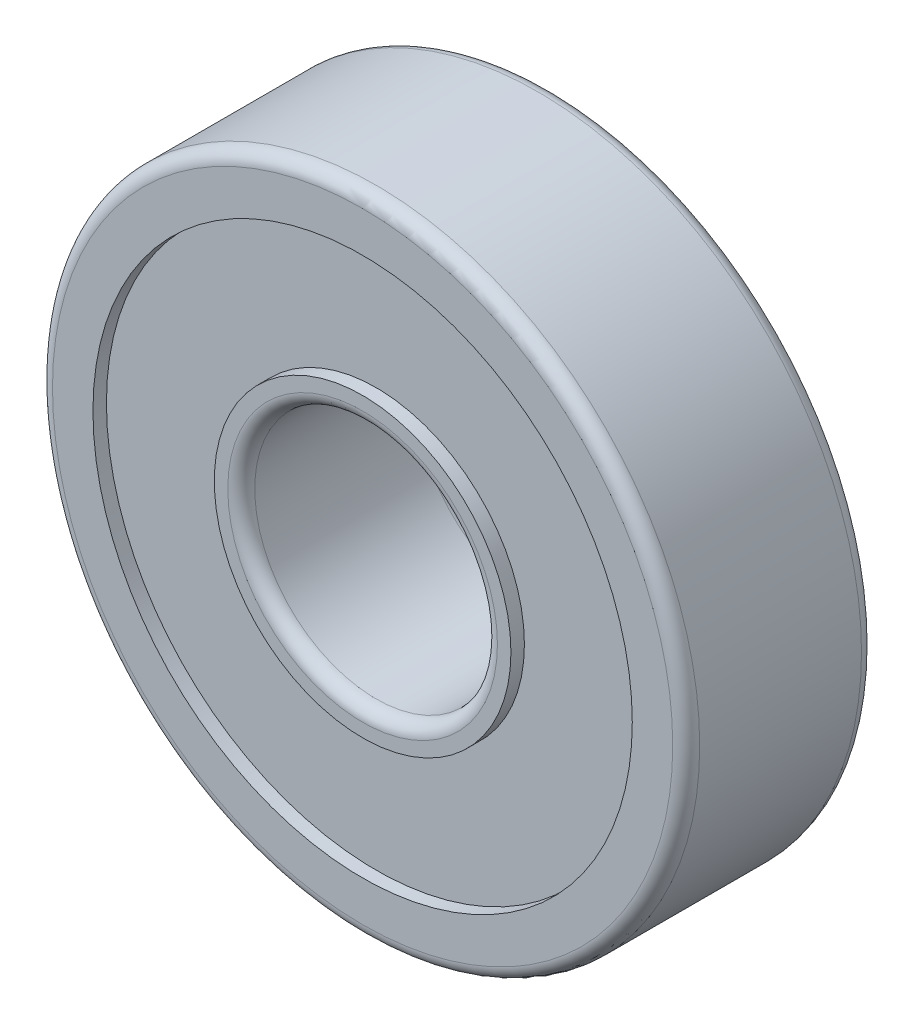
ISO-10303-21;
HEADER;
FILE_DESCRIPTION(('STEP AP214'),'2;1');
FILE_NAME('part.step','',(''),(''),'','','');
FILE_SCHEMA(('AUTOMOTIVE_DESIGN { 1 0 10303 214 1 1 1 1 }'));
ENDSEC;
DATA;
#1=APPLICATION_CONTEXT('core data for automotive mechanical design processes');
#2=APPLICATION_PROTOCOL_DEFINITION('international standard','automotive_design',2000,#1);
#3=PRODUCT_CONTEXT('',#1,'mechanical');
#4=PRODUCT('Part','Part','',(#3));
#5=PRODUCT_RELATED_PRODUCT_CATEGORY('part','',(#4));
#6=PRODUCT_DEFINITION_FORMATION('','',#4);
#7=PRODUCT_DEFINITION_CONTEXT('part definition',#1,'design');
#8=PRODUCT_DEFINITION('design','',#6,#7);
#9=PRODUCT_DEFINITION_SHAPE('','',#8);
#10=(LENGTH_UNIT() NAMED_UNIT(*) SI_UNIT(.MILLI.,.METRE.));
#11=(NAMED_UNIT(*) PLANE_ANGLE_UNIT() SI_UNIT($,.RADIAN.));
#12=(NAMED_UNIT(*) SI_UNIT($,.STERADIAN.) SOLID_ANGLE_UNIT());
#13=UNCERTAINTY_MEASURE_WITH_UNIT(LENGTH_MEASURE(1.E-05),#10,'distance_accuracy_value','');
#14=(GEOMETRIC_REPRESENTATION_CONTEXT(3) GLOBAL_UNCERTAINTY_ASSIGNED_CONTEXT((#13)) GLOBAL_UNIT_ASSIGNED_CONTEXT((#10,
#11,#12)) REPRESENTATION_CONTEXT('',''));
#15=CARTESIAN_POINT('',(0.,0.,0.));
#16=DIRECTION('',(0.,0.,1.));
#17=DIRECTION('',(1.,0.,0.));
#18=AXIS2_PLACEMENT_3D('',#15,#16,#17);
#19=CARTESIAN_POINT('',(0.,0.,-3.5));
#20=DIRECTION('',(0.,0.,1.));
#21=DIRECTION('',(1.,0.,0.));
#22=AXIS2_PLACEMENT_3D('',#19,#20,#21);
#23=PLANE('',#22);
#24=CARTESIAN_POINT('',(0.,0.,-3.5));
#25=DIRECTION('',(0.,0.,1.));
#26=DIRECTION('',(1.,0.,0.));
#27=AXIS2_PLACEMENT_3D('',#24,#25,#26);
#28=CIRCLE('',#27,5.);
#29=CARTESIAN_POINT('',(5.,0.,-3.5));
#30=VERTEX_POINT('',#29);
#31=EDGE_CURVE('E44',#30,#30,#28,.T.);
#32=ORIENTED_EDGE('',*,*,#31,.T.);
#33=EDGE_LOOP('',(#32));
#34=FACE_BOUND('',#33,.T.);
#35=CARTESIAN_POINT('',(0.,0.,-3.5));
#36=DIRECTION('',(0.,0.,1.));
#37=DIRECTION('',(1.,0.,0.));
#38=AXIS2_PLACEMENT_3D('',#35,#36,#37);
#39=CIRCLE('',#38,5.5);
#40=CARTESIAN_POINT('',(5.5,0.,-3.5));
#41=VERTEX_POINT('',#40);
#42=EDGE_CURVE('E84',#41,#41,#39,.T.);
#43=ORIENTED_EDGE('',*,*,#42,.F.);
#44=EDGE_LOOP('',(#43));
#45=FACE_BOUND('',#44,.T.);
#46=ADVANCED_FACE('F33',(#34,#45),#23,.F.);
#47=CARTESIAN_POINT('',(0.,0.,3.5));
#48=DIRECTION('',(0.,0.,1.));
#49=DIRECTION('',(1.,0.,0.));
#50=AXIS2_PLACEMENT_3D('',#47,#48,#49);
#51=PLANE('',#50);
#52=CARTESIAN_POINT('',(0.,0.,3.5));
#53=DIRECTION('',(0.,0.,1.));
#54=DIRECTION('',(1.,0.,0.));
#55=AXIS2_PLACEMENT_3D('',#52,#53,#54);
#56=CIRCLE('',#55,5.);
#57=CARTESIAN_POINT('',(5.,0.,3.5));
#58=VERTEX_POINT('',#57);
#59=EDGE_CURVE('E53',#58,#58,#56,.F.);
#60=ORIENTED_EDGE('',*,*,#59,.T.);
#61=EDGE_LOOP('',(#60));
#62=FACE_BOUND('',#61,.T.);
#63=CARTESIAN_POINT('',(0.,0.,3.5));
#64=DIRECTION('',(0.,0.,1.));
#65=DIRECTION('',(1.,0.,0.));
#66=AXIS2_PLACEMENT_3D('',#63,#64,#65);
#67=CIRCLE('',#66,5.5);
#68=CARTESIAN_POINT('',(5.5,0.,3.5));
#69=VERTEX_POINT('',#68);
#70=EDGE_CURVE('E72',#69,#69,#67,.T.);
#71=ORIENTED_EDGE('',*,*,#70,.T.);
#72=EDGE_LOOP('',(#71));
#73=FACE_BOUND('',#72,.T.);
#74=ADVANCED_FACE('F100',(#62,#73),#51,.T.);
#75=CARTESIAN_POINT('',(0.,0.,3.5));
#76=DIRECTION('',(0.,0.,1.));
#77=DIRECTION('',(1.,0.,0.));
#78=AXIS2_PLACEMENT_3D('',#75,#76,#77);
#79=CIRCLE('',#78,10.);
#80=CARTESIAN_POINT('',(10.,0.,3.5));
#81=VERTEX_POINT('',#80);
#82=EDGE_CURVE('E66',#81,#81,#79,.T.);
#83=ORIENTED_EDGE('',*,*,#82,.F.);
#84=EDGE_LOOP('',(#83));
#85=FACE_BOUND('',#84,.T.);
#86=CARTESIAN_POINT('',(0.,0.,3.5));
#87=DIRECTION('',(0.,0.,1.));
#88=DIRECTION('',(1.,0.,0.));
#89=AXIS2_PLACEMENT_3D('',#86,#87,#88);
#90=CIRCLE('',#89,11.5);
#91=CARTESIAN_POINT('',(11.5,0.,3.5));
#92=VERTEX_POINT('',#91);
#93=EDGE_CURVE('E56',#92,#92,#90,.T.);
#94=ORIENTED_EDGE('',*,*,#93,.T.);
#95=EDGE_LOOP('',(#94));
#96=FACE_BOUND('',#95,.T.);
#97=ADVANCED_FACE('F107',(#85,#96),#51,.T.);
#98=CARTESIAN_POINT('',(0.,0.,-3.5));
#99=DIRECTION('',(0.,0.,1.));
#100=DIRECTION('',(1.,0.,0.));
#101=AXIS2_PLACEMENT_3D('',#98,#99,#100);
#102=CIRCLE('',#101,10.);
#103=CARTESIAN_POINT('',(10.,0.,-3.5));
#104=VERTEX_POINT('',#103);
#105=EDGE_CURVE('E78',#104,#104,#102,.T.);
#106=ORIENTED_EDGE('',*,*,#105,.T.);
#107=EDGE_LOOP('',(#106));
#108=FACE_BOUND('',#107,.T.);
#109=CARTESIAN_POINT('',(0.,0.,-3.5));
#110=DIRECTION('',(0.,0.,1.));
#111=DIRECTION('',(1.,0.,0.));
#112=AXIS2_PLACEMENT_3D('',#109,#110,#111);
#113=CIRCLE('',#112,11.5);
#114=CARTESIAN_POINT('',(11.5,0.,-3.5));
#115=VERTEX_POINT('',#114);
#116=EDGE_CURVE('E48',#115,#115,#113,.F.);
#117=ORIENTED_EDGE('',*,*,#116,.T.);
#118=EDGE_LOOP('',(#117));
#119=FACE_BOUND('',#118,.T.);
#120=ADVANCED_FACE('F103',(#108,#119),#23,.F.);
#121=CARTESIAN_POINT('',(0.,0.,3.5));
#122=DIRECTION('',(0.,0.,-1.));
#123=DIRECTION('',(-1.,0.,0.));
#124=AXIS2_PLACEMENT_3D('',#121,#122,#123);
#125=CYLINDRICAL_SURFACE('',#124,12.);
#126=CARTESIAN_POINT('',(0.,0.,-3.));
#127=DIRECTION('',(0.,0.,1.));
#128=DIRECTION('',(1.,0.,0.));
#129=AXIS2_PLACEMENT_3D('',#126,#127,#128);
#130=CIRCLE('',#129,12.);
#131=CARTESIAN_POINT('',(12.,0.,-3.));
#132=VERTEX_POINT('',#131);
#133=EDGE_CURVE('E10',#132,#132,#130,.T.);
#134=ORIENTED_EDGE('',*,*,#133,.T.);
#135=EDGE_LOOP('',(#134));
#136=FACE_BOUND('',#135,.T.);
#137=CARTESIAN_POINT('',(0.,0.,3.));
#138=DIRECTION('',(0.,0.,1.));
#139=DIRECTION('',(1.,0.,0.));
#140=AXIS2_PLACEMENT_3D('',#137,#138,#139);
#141=CIRCLE('',#140,12.);
#142=CARTESIAN_POINT('',(12.,0.,3.));
#143=VERTEX_POINT('',#142);
#144=EDGE_CURVE('E40',#143,#143,#141,.F.);
#145=ORIENTED_EDGE('',*,*,#144,.T.);
#146=EDGE_LOOP('',(#145));
#147=FACE_BOUND('',#146,.T.);
#148=ADVANCED_FACE('F112',(#136,#147),#125,.T.);
#149=CARTESIAN_POINT('',(0.,0.,3.5));
#150=DIRECTION('',(0.,0.,-1.));
#151=DIRECTION('',(-1.,0.,0.));
#152=AXIS2_PLACEMENT_3D('',#149,#150,#151);
#153=CYLINDRICAL_SURFACE('',#152,4.5);
#154=CARTESIAN_POINT('',(0.,0.,3.));
#155=DIRECTION('',(0.,0.,1.));
#156=DIRECTION('',(1.,0.,0.));
#157=AXIS2_PLACEMENT_3D('',#154,#155,#156);
#158=CIRCLE('',#157,4.5);
#159=CARTESIAN_POINT('',(4.5,0.,3.));
#160=VERTEX_POINT('',#159);
#161=EDGE_CURVE('E59',#160,#160,#158,.T.);
#162=ORIENTED_EDGE('',*,*,#161,.T.);
#163=EDGE_LOOP('',(#162));
#164=FACE_BOUND('',#163,.T.);
#165=CARTESIAN_POINT('',(0.,0.,-3.));
#166=DIRECTION('',(0.,0.,1.));
#167=DIRECTION('',(1.,0.,0.));
#168=AXIS2_PLACEMENT_3D('',#165,#166,#167);
#169=CIRCLE('',#168,4.5);
#170=CARTESIAN_POINT('',(4.5,0.,-3.));
#171=VERTEX_POINT('',#170);
#172=EDGE_CURVE('E62',#171,#171,#169,.F.);
#173=ORIENTED_EDGE('',*,*,#172,.T.);
#174=EDGE_LOOP('',(#173));
#175=FACE_BOUND('',#174,.T.);
#176=ADVANCED_FACE('F118',(#164,#175),#153,.F.);
#177=CARTESIAN_POINT('',(0.,0.,3.));
#178=DIRECTION('',(0.,0.,1.));
#179=DIRECTION('',(1.,0.,0.));
#180=AXIS2_PLACEMENT_3D('',#177,#178,#179);
#181=TOROIDAL_SURFACE('',#180,5.,0.5);
#182=ORIENTED_EDGE('',*,*,#59,.F.);
#183=EDGE_LOOP('',(#182));
#184=FACE_BOUND('',#183,.T.);
#185=ORIENTED_EDGE('',*,*,#161,.F.);
#186=EDGE_LOOP('',(#185));
#187=FACE_BOUND('',#186,.T.);
#188=ADVANCED_FACE('F134',(#184,#187),#181,.T.);
#189=CARTESIAN_POINT('',(0.,0.,-3.));
#190=DIRECTION('',(0.,0.,1.));
#191=DIRECTION('',(1.,0.,0.));
#192=AXIS2_PLACEMENT_3D('',#189,#190,#191);
#193=TOROIDAL_SURFACE('',#192,5.,0.5);
#194=ORIENTED_EDGE('',*,*,#172,.F.);
#195=EDGE_LOOP('',(#194));
#196=FACE_BOUND('',#195,.T.);
#197=ORIENTED_EDGE('',*,*,#31,.F.);
#198=EDGE_LOOP('',(#197));
#199=FACE_BOUND('',#198,.T.);
#200=ADVANCED_FACE('F127',(#196,#199),#193,.T.);
#201=CARTESIAN_POINT('',(0.,0.,-3.));
#202=DIRECTION('',(0.,0.,1.));
#203=DIRECTION('',(1.,0.,0.));
#204=AXIS2_PLACEMENT_3D('',#201,#202,#203);
#205=TOROIDAL_SURFACE('',#204,11.5,0.5);
#206=ORIENTED_EDGE('',*,*,#116,.F.);
#207=EDGE_LOOP('',(#206));
#208=FACE_BOUND('',#207,.T.);
#209=ORIENTED_EDGE('',*,*,#133,.F.);
#210=EDGE_LOOP('',(#209));
#211=FACE_BOUND('',#210,.T.);
#212=ADVANCED_FACE('F124',(#208,#211),#205,.T.);
#213=CARTESIAN_POINT('',(0.,0.,3.));
#214=DIRECTION('',(0.,0.,1.));
#215=DIRECTION('',(1.,0.,0.));
#216=AXIS2_PLACEMENT_3D('',#213,#214,#215);
#217=TOROIDAL_SURFACE('',#216,11.5,0.5);
#218=ORIENTED_EDGE('',*,*,#144,.F.);
#219=EDGE_LOOP('',(#218));
#220=FACE_BOUND('',#219,.T.);
#221=ORIENTED_EDGE('',*,*,#93,.F.);
#222=EDGE_LOOP('',(#221));
#223=FACE_BOUND('',#222,.T.);
#224=ADVANCED_FACE('F35',(#220,#223),#217,.T.);
#225=CARTESIAN_POINT('',(0.,0.,3.));
#226=DIRECTION('',(0.,0.,1.));
#227=DIRECTION('',(1.,0.,0.));
#228=AXIS2_PLACEMENT_3D('',#225,#226,#227);
#229=CYLINDRICAL_SURFACE('',#228,10.);
#230=CARTESIAN_POINT('',(0.,0.,3.));
#231=DIRECTION('',(0.,0.,1.));
#232=DIRECTION('',(1.,0.,0.));
#233=AXIS2_PLACEMENT_3D('',#230,#231,#232);
#234=CIRCLE('',#233,10.);
#235=CARTESIAN_POINT('',(10.,0.,3.));
#236=VERTEX_POINT('',#235);
#237=EDGE_CURVE('E65',#236,#236,#234,.T.);
#238=ORIENTED_EDGE('',*,*,#237,.F.);
#239=EDGE_LOOP('',(#238));
#240=FACE_BOUND('',#239,.T.);
#241=ORIENTED_EDGE('',*,*,#82,.T.);
#242=EDGE_LOOP('',(#241));
#243=FACE_BOUND('',#242,.T.);
#244=ADVANCED_FACE('F132',(#240,#243),#229,.F.);
#245=CARTESIAN_POINT('',(0.,0.,3.));
#246=DIRECTION('',(0.,0.,1.));
#247=DIRECTION('',(1.,0.,0.));
#248=AXIS2_PLACEMENT_3D('',#245,#246,#247);
#249=PLANE('',#248);
#250=CARTESIAN_POINT('',(0.,0.,3.));
#251=DIRECTION('',(0.,0.,1.));
#252=DIRECTION('',(1.,0.,0.));
#253=AXIS2_PLACEMENT_3D('',#250,#251,#252);
#254=CIRCLE('',#253,5.5);
#255=CARTESIAN_POINT('',(5.5,0.,3.));
#256=VERTEX_POINT('',#255);
#257=EDGE_CURVE('E69',#256,#256,#254,.T.);
#258=ORIENTED_EDGE('',*,*,#257,.F.);
#259=EDGE_LOOP('',(#258));
#260=FACE_BOUND('',#259,.T.);
#261=ORIENTED_EDGE('',*,*,#237,.T.);
#262=EDGE_LOOP('',(#261));
#263=FACE_BOUND('',#262,.T.);
#264=ADVANCED_FACE('F157',(#260,#263),#249,.T.);
#265=CARTESIAN_POINT('',(0.,0.,3.));
#266=DIRECTION('',(0.,0.,1.));
#267=DIRECTION('',(1.,0.,0.));
#268=AXIS2_PLACEMENT_3D('',#265,#266,#267);
#269=CYLINDRICAL_SURFACE('',#268,5.5);
#270=ORIENTED_EDGE('',*,*,#257,.T.);
#271=EDGE_LOOP('',(#270));
#272=FACE_BOUND('',#271,.T.);
#273=ORIENTED_EDGE('',*,*,#70,.F.);
#274=EDGE_LOOP('',(#273));
#275=FACE_BOUND('',#274,.T.);
#276=ADVANCED_FACE('F155',(#272,#275),#269,.T.);
#277=CARTESIAN_POINT('',(0.,0.,-3.));
#278=DIRECTION('',(0.,0.,-1.));
#279=DIRECTION('',(1.,0.,0.));
#280=AXIS2_PLACEMENT_3D('',#277,#278,#279);
#281=PLANE('',#280);
#282=CARTESIAN_POINT('',(0.,0.,-3.));
#283=DIRECTION('',(0.,0.,1.));
#284=DIRECTION('',(1.,0.,0.));
#285=AXIS2_PLACEMENT_3D('',#282,#283,#284);
#286=CIRCLE('',#285,10.);
#287=CARTESIAN_POINT('',(10.,0.,-3.));
#288=VERTEX_POINT('',#287);
#289=EDGE_CURVE('E75',#288,#288,#286,.T.);
#290=ORIENTED_EDGE('',*,*,#289,.F.);
#291=EDGE_LOOP('',(#290));
#292=FACE_BOUND('',#291,.T.);
#293=CARTESIAN_POINT('',(0.,0.,-3.));
#294=DIRECTION('',(0.,0.,1.));
#295=DIRECTION('',(1.,0.,0.));
#296=AXIS2_PLACEMENT_3D('',#293,#294,#295);
#297=CIRCLE('',#296,5.5);
#298=CARTESIAN_POINT('',(5.5,0.,-3.));
#299=VERTEX_POINT('',#298);
#300=EDGE_CURVE('E81',#299,#299,#297,.T.);
#301=ORIENTED_EDGE('',*,*,#300,.T.);
#302=EDGE_LOOP('',(#301));
#303=FACE_BOUND('',#302,.T.);
#304=ADVANCED_FACE('F90',(#292,#303),#281,.T.);
#305=CARTESIAN_POINT('',(0.,0.,-3.));
#306=DIRECTION('',(0.,0.,-1.));
#307=DIRECTION('',(-1.,0.,0.));
#308=AXIS2_PLACEMENT_3D('',#305,#306,#307);
#309=CYLINDRICAL_SURFACE('',#308,10.);
#310=ORIENTED_EDGE('',*,*,#289,.T.);
#311=EDGE_LOOP('',(#310));
#312=FACE_BOUND('',#311,.T.);
#313=ORIENTED_EDGE('',*,*,#105,.F.);
#314=EDGE_LOOP('',(#313));
#315=FACE_BOUND('',#314,.T.);
#316=ADVANCED_FACE('F95',(#312,#315),#309,.F.);
#317=CARTESIAN_POINT('',(0.,0.,-3.));
#318=DIRECTION('',(0.,0.,-1.));
#319=DIRECTION('',(-1.,0.,0.));
#320=AXIS2_PLACEMENT_3D('',#317,#318,#319);
#321=CYLINDRICAL_SURFACE('',#320,5.5);
#322=ORIENTED_EDGE('',*,*,#300,.F.);
#323=EDGE_LOOP('',(#322));
#324=FACE_BOUND('',#323,.T.);
#325=ORIENTED_EDGE('',*,*,#42,.T.);
#326=EDGE_LOOP('',(#325));
#327=FACE_BOUND('',#326,.T.);
#328=ADVANCED_FACE('F92',(#324,#327),#321,.T.);
#329=CLOSED_SHELL('',(#46,#74,#97,#120,#148,#176,#188,#200,#212,#224,#244,#264,#276,#304,#316,#328));
#330=MANIFOLD_SOLID_BREP('B2',#329);
#331=ADVANCED_BREP_SHAPE_REPRESENTATION('',(#18,#330),#14);
#332=SHAPE_DEFINITION_REPRESENTATION(#9,#331);
ENDSEC;
END-ISO-10303-21;
